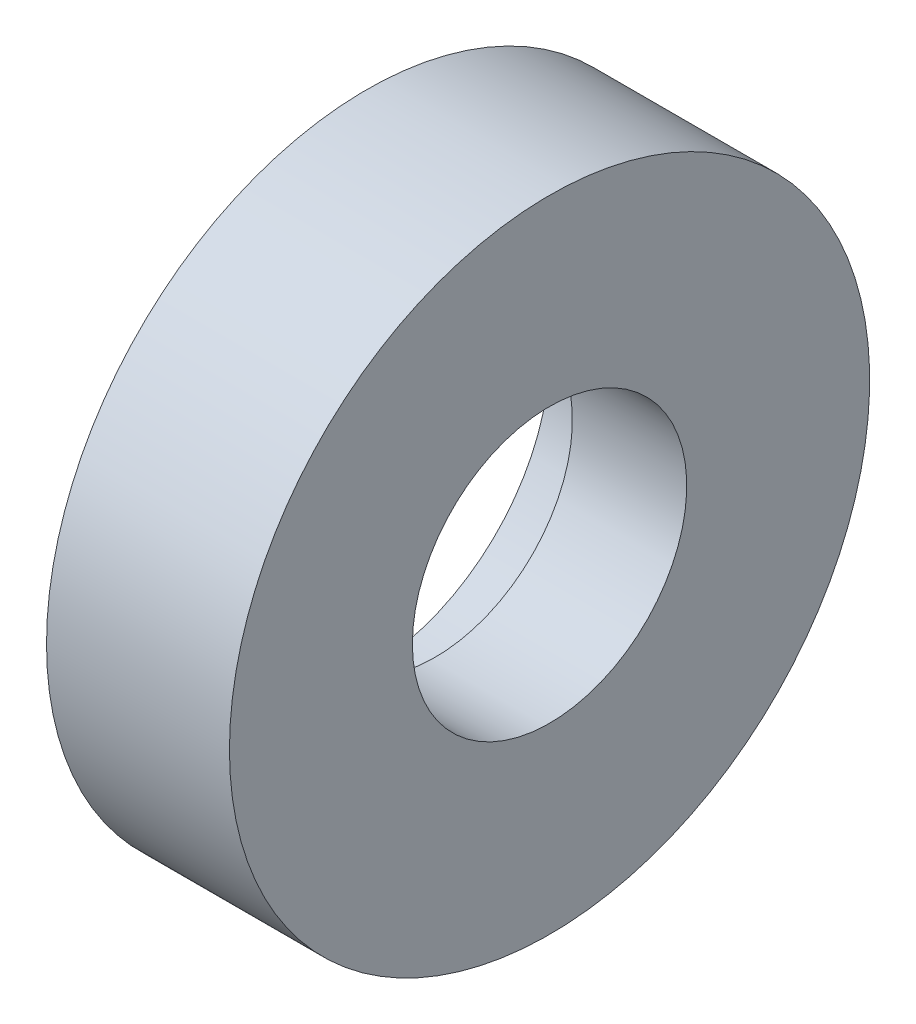
ISO-10303-21;
HEADER;
FILE_DESCRIPTION(('STEP AP214'),'2;1');
FILE_NAME('part.step','',(''),(''),'','','');
FILE_SCHEMA(('AUTOMOTIVE_DESIGN { 1 0 10303 214 1 1 1 1 }'));
ENDSEC;
DATA;
#1=APPLICATION_CONTEXT('core data for automotive mechanical design processes');
#2=APPLICATION_PROTOCOL_DEFINITION('international standard','automotive_design',2000,#1);
#3=PRODUCT_CONTEXT('',#1,'mechanical');
#4=PRODUCT('Part','Part','',(#3));
#5=PRODUCT_RELATED_PRODUCT_CATEGORY('part','',(#4));
#6=PRODUCT_DEFINITION_FORMATION('','',#4);
#7=PRODUCT_DEFINITION_CONTEXT('part definition',#1,'design');
#8=PRODUCT_DEFINITION('design','',#6,#7);
#9=PRODUCT_DEFINITION_SHAPE('','',#8);
#10=(LENGTH_UNIT() NAMED_UNIT(*) SI_UNIT(.MILLI.,.METRE.));
#11=(NAMED_UNIT(*) PLANE_ANGLE_UNIT() SI_UNIT($,.RADIAN.));
#12=(NAMED_UNIT(*) SI_UNIT($,.STERADIAN.) SOLID_ANGLE_UNIT());
#13=UNCERTAINTY_MEASURE_WITH_UNIT(LENGTH_MEASURE(1.E-05),#10,'distance_accuracy_value','');
#14=(GEOMETRIC_REPRESENTATION_CONTEXT(3) GLOBAL_UNCERTAINTY_ASSIGNED_CONTEXT((#13)) GLOBAL_UNIT_ASSIGNED_CONTEXT((#10,
#11,#12)) REPRESENTATION_CONTEXT('',''));
#15=CARTESIAN_POINT('',(0.,0.,0.));
#16=DIRECTION('',(0.,0.,1.));
#17=DIRECTION('',(1.,0.,0.));
#18=AXIS2_PLACEMENT_3D('',#15,#16,#17);
#19=CARTESIAN_POINT('',(0.,0.,0.));
#20=DIRECTION('',(-1.,0.,0.));
#21=DIRECTION('',(0.,0.,1.));
#22=AXIS2_PLACEMENT_3D('',#19,#20,#21);
#23=CYLINDRICAL_SURFACE('',#22,14.);
#24=CARTESIAN_POINT('',(8.58860818547331,0.,0.));
#25=DIRECTION('',(-1.,0.,0.));
#26=DIRECTION('',(0.,0.,1.));
#27=AXIS2_PLACEMENT_3D('',#24,#25,#26);
#28=CIRCLE('',#27,14.);
#29=CARTESIAN_POINT('',(8.58860818547331,0.,14.));
#30=VERTEX_POINT('',#29);
#31=EDGE_CURVE('E10',#30,#30,#28,.T.);
#32=ORIENTED_EDGE('',*,*,#31,.F.);
#33=EDGE_LOOP('',(#32));
#34=FACE_BOUND('',#33,.T.);
#35=CARTESIAN_POINT('',(16.5886081854733,0.,0.));
#36=DIRECTION('',(-1.,0.,0.));
#37=DIRECTION('',(0.,0.,1.));
#38=AXIS2_PLACEMENT_3D('',#35,#36,#37);
#39=CIRCLE('',#38,14.);
#40=CARTESIAN_POINT('',(16.5886081854733,0.,14.));
#41=VERTEX_POINT('',#40);
#42=EDGE_CURVE('E52',#41,#41,#39,.T.);
#43=ORIENTED_EDGE('',*,*,#42,.T.);
#44=EDGE_LOOP('',(#43));
#45=FACE_BOUND('',#44,.T.);
#46=ADVANCED_FACE('F30',(#34,#45),#23,.T.);
#47=CARTESIAN_POINT('',(8.58860818547331,0.,-14.));
#48=DIRECTION('',(1.,0.,0.));
#49=DIRECTION('',(0.,0.,-1.));
#50=AXIS2_PLACEMENT_3D('',#47,#48,#49);
#51=PLANE('',#50);
#52=CARTESIAN_POINT('',(8.58860818547331,0.,0.));
#53=DIRECTION('',(-1.,0.,0.));
#54=DIRECTION('',(0.,0.,1.));
#55=AXIS2_PLACEMENT_3D('',#52,#53,#54);
#56=CIRCLE('',#55,8.);
#57=CARTESIAN_POINT('',(8.58860818547331,0.,8.));
#58=VERTEX_POINT('',#57);
#59=EDGE_CURVE('E36',#58,#58,#56,.T.);
#60=ORIENTED_EDGE('',*,*,#59,.F.);
#61=EDGE_LOOP('',(#60));
#62=FACE_BOUND('',#61,.T.);
#63=ORIENTED_EDGE('',*,*,#31,.T.);
#64=EDGE_LOOP('',(#63));
#65=FACE_BOUND('',#64,.T.);
#66=ADVANCED_FACE('F77',(#62,#65),#51,.F.);
#67=CARTESIAN_POINT('',(0.,0.,0.));
#68=DIRECTION('',(-1.,0.,0.));
#69=DIRECTION('',(0.,0.,1.));
#70=AXIS2_PLACEMENT_3D('',#67,#68,#69);
#71=CYLINDRICAL_SURFACE('',#70,8.);
#72=CARTESIAN_POINT('',(11.5886081854733,0.,0.));
#73=DIRECTION('',(-1.,0.,0.));
#74=DIRECTION('',(0.,0.,1.));
#75=AXIS2_PLACEMENT_3D('',#72,#73,#74);
#76=CIRCLE('',#75,8.);
#77=CARTESIAN_POINT('',(11.5886081854733,0.,8.));
#78=VERTEX_POINT('',#77);
#79=EDGE_CURVE('E40',#78,#78,#76,.T.);
#80=ORIENTED_EDGE('',*,*,#79,.F.);
#81=EDGE_LOOP('',(#80));
#82=FACE_BOUND('',#81,.T.);
#83=ORIENTED_EDGE('',*,*,#59,.T.);
#84=EDGE_LOOP('',(#83));
#85=FACE_BOUND('',#84,.T.);
#86=ADVANCED_FACE('F72',(#82,#85),#71,.F.);
#87=CARTESIAN_POINT('',(11.5886081854733,0.,-8.));
#88=DIRECTION('',(1.,0.,0.));
#89=DIRECTION('',(0.,0.,-1.));
#90=AXIS2_PLACEMENT_3D('',#87,#88,#89);
#91=PLANE('',#90);
#92=CARTESIAN_POINT('',(11.5886081854733,0.,0.));
#93=DIRECTION('',(-1.,0.,0.));
#94=DIRECTION('',(0.,0.,1.));
#95=AXIS2_PLACEMENT_3D('',#92,#93,#94);
#96=CIRCLE('',#95,6.);
#97=CARTESIAN_POINT('',(11.5886081854733,0.,6.));
#98=VERTEX_POINT('',#97);
#99=EDGE_CURVE('E44',#98,#98,#96,.T.);
#100=ORIENTED_EDGE('',*,*,#99,.F.);
#101=EDGE_LOOP('',(#100));
#102=FACE_BOUND('',#101,.T.);
#103=ORIENTED_EDGE('',*,*,#79,.T.);
#104=EDGE_LOOP('',(#103));
#105=FACE_BOUND('',#104,.T.);
#106=ADVANCED_FACE('F66',(#102,#105),#91,.F.);
#107=CARTESIAN_POINT('',(0.,0.,0.));
#108=DIRECTION('',(-1.,0.,0.));
#109=DIRECTION('',(0.,0.,1.));
#110=AXIS2_PLACEMENT_3D('',#107,#108,#109);
#111=CYLINDRICAL_SURFACE('',#110,6.);
#112=CARTESIAN_POINT('',(16.5886081854733,0.,0.));
#113=DIRECTION('',(-1.,0.,0.));
#114=DIRECTION('',(0.,0.,1.));
#115=AXIS2_PLACEMENT_3D('',#112,#113,#114);
#116=CIRCLE('',#115,6.);
#117=CARTESIAN_POINT('',(16.5886081854733,0.,6.));
#118=VERTEX_POINT('',#117);
#119=EDGE_CURVE('E49',#118,#118,#116,.T.);
#120=ORIENTED_EDGE('',*,*,#119,.F.);
#121=EDGE_LOOP('',(#120));
#122=FACE_BOUND('',#121,.T.);
#123=ORIENTED_EDGE('',*,*,#99,.T.);
#124=EDGE_LOOP('',(#123));
#125=FACE_BOUND('',#124,.T.);
#126=ADVANCED_FACE('F60',(#122,#125),#111,.F.);
#127=CARTESIAN_POINT('',(16.5886081854733,0.,-6.));
#128=DIRECTION('',(-1.,0.,0.));
#129=DIRECTION('',(0.,0.,1.));
#130=AXIS2_PLACEMENT_3D('',#127,#128,#129);
#131=PLANE('',#130);
#132=ORIENTED_EDGE('',*,*,#42,.F.);
#133=EDGE_LOOP('',(#132));
#134=FACE_BOUND('',#133,.T.);
#135=ORIENTED_EDGE('',*,*,#119,.T.);
#136=EDGE_LOOP('',(#135));
#137=FACE_BOUND('',#136,.T.);
#138=ADVANCED_FACE('F57',(#134,#137),#131,.F.);
#139=CLOSED_SHELL('',(#46,#66,#86,#106,#126,#138));
#140=MANIFOLD_SOLID_BREP('B2',#139);
#141=ADVANCED_BREP_SHAPE_REPRESENTATION('',(#18,#140),#14);
#142=SHAPE_DEFINITION_REPRESENTATION(#9,#141);
ENDSEC;
END-ISO-10303-21;
